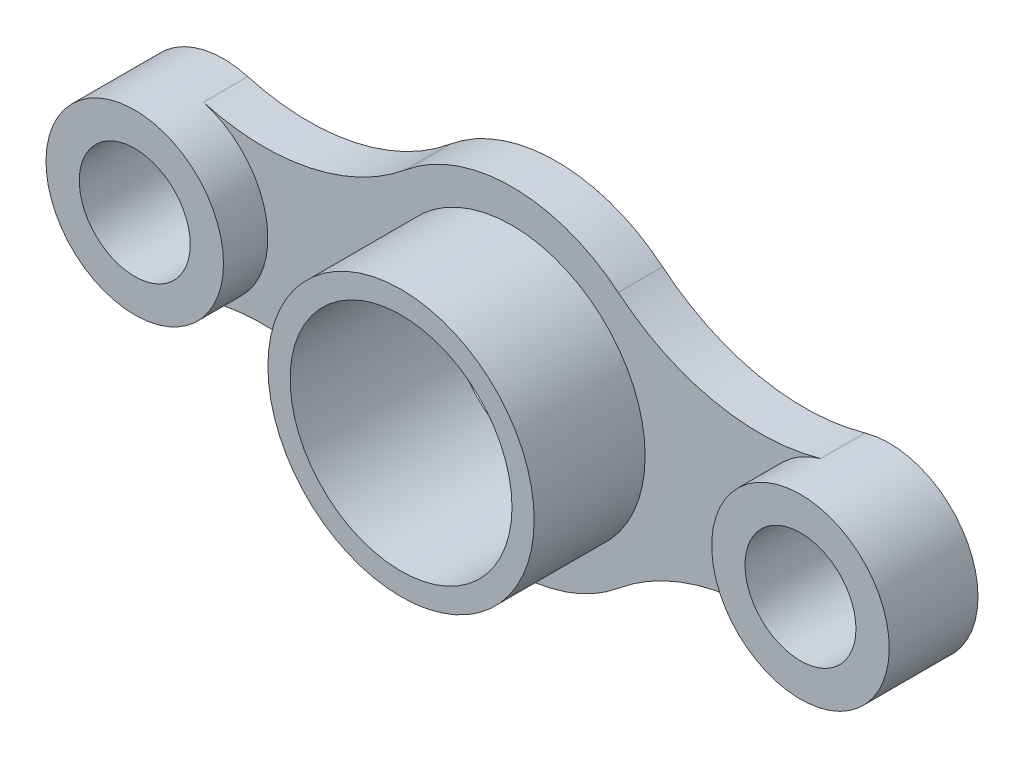
ISO-10303-21;
HEADER;
FILE_DESCRIPTION(('STEP AP214'),'2;1');
FILE_NAME('part.step','',(''),(''),'','','');
FILE_SCHEMA(('AUTOMOTIVE_DESIGN { 1 0 10303 214 1 1 1 1 }'));
ENDSEC;
DATA;
#1=APPLICATION_CONTEXT('core data for automotive mechanical design processes');
#2=APPLICATION_PROTOCOL_DEFINITION('international standard','automotive_design',2000,#1);
#3=PRODUCT_CONTEXT('',#1,'mechanical');
#4=PRODUCT('Part','Part','',(#3));
#5=PRODUCT_RELATED_PRODUCT_CATEGORY('part','',(#4));
#6=PRODUCT_DEFINITION_FORMATION('','',#4);
#7=PRODUCT_DEFINITION_CONTEXT('part definition',#1,'design');
#8=PRODUCT_DEFINITION('design','',#6,#7);
#9=PRODUCT_DEFINITION_SHAPE('','',#8);
#10=(LENGTH_UNIT() NAMED_UNIT(*) SI_UNIT(.MILLI.,.METRE.));
#11=(NAMED_UNIT(*) PLANE_ANGLE_UNIT() SI_UNIT($,.RADIAN.));
#12=(NAMED_UNIT(*) SI_UNIT($,.STERADIAN.) SOLID_ANGLE_UNIT());
#13=UNCERTAINTY_MEASURE_WITH_UNIT(LENGTH_MEASURE(1.E-05),#10,'distance_accuracy_value','');
#14=(GEOMETRIC_REPRESENTATION_CONTEXT(3) GLOBAL_UNCERTAINTY_ASSIGNED_CONTEXT((#13)) GLOBAL_UNIT_ASSIGNED_CONTEXT((#10,
#11,#12)) REPRESENTATION_CONTEXT('',''));
#15=CARTESIAN_POINT('',(0.,0.,0.));
#16=DIRECTION('',(0.,0.,1.));
#17=DIRECTION('',(1.,0.,0.));
#18=AXIS2_PLACEMENT_3D('',#15,#16,#17);
#19=CARTESIAN_POINT('',(-111.75,-134.673447642807,20.));
#20=DIRECTION('',(0.,0.,-1.));
#21=DIRECTION('',(-1.,0.,0.));
#22=AXIS2_PLACEMENT_3D('',#19,#20,#21);
#23=CYLINDRICAL_SURFACE('',#22,100.);
#24=CARTESIAN_POINT('',(-111.75,-134.673447642807,0.));
#25=DIRECTION('',(0.,0.,-1.));
#26=DIRECTION('',(-1.,0.,0.));
#27=AXIS2_PLACEMENT_3D('',#24,#25,#26);
#28=CIRCLE('',#27,100.);
#29=CARTESIAN_POINT('',(-139.071428571429,-38.478127897945,0.));
#30=VERTEX_POINT('',#29);
#31=CARTESIAN_POINT('',(-47.8928571428571,-57.7171918469175,0.));
#32=VERTEX_POINT('',#31);
#33=EDGE_CURVE('E139',#30,#32,#28,.T.);
#34=ORIENTED_EDGE('',*,*,#33,.T.);
#35=DIRECTION('',(0.,0.,-1.));
#36=VECTOR('',#35,1.);
#37=CARTESIAN_POINT('',(-47.8928571428571,-57.7171918469175,20.));
#38=LINE('',#37,#36);
#39=CARTESIAN_POINT('',(-47.8928571428571,-57.7171918469175,20.));
#40=VERTEX_POINT('',#39);
#41=EDGE_CURVE('E166',#40,#32,#38,.T.);
#42=ORIENTED_EDGE('',*,*,#41,.F.);
#43=CARTESIAN_POINT('',(-111.75,-134.673447642807,20.));
#44=DIRECTION('',(0.,0.,-1.));
#45=DIRECTION('',(-1.,0.,0.));
#46=AXIS2_PLACEMENT_3D('',#43,#44,#45);
#47=CIRCLE('',#46,100.);
#48=CARTESIAN_POINT('',(-139.071428571429,-38.478127897945,20.));
#49=VERTEX_POINT('',#48);
#50=EDGE_CURVE('E154',#49,#40,#47,.T.);
#51=ORIENTED_EDGE('',*,*,#50,.F.);
#52=DIRECTION('',(0.,0.,-1.));
#53=VECTOR('',#52,1.);
#54=CARTESIAN_POINT('',(-139.071428571429,-38.478127897945,20.));
#55=LINE('',#54,#53);
#56=EDGE_CURVE('E135',#49,#30,#55,.T.);
#57=ORIENTED_EDGE('',*,*,#56,.T.);
#58=EDGE_LOOP('',(#34,#42,#51,#57));
#59=FACE_BOUND('',#58,.T.);
#60=ADVANCED_FACE('F35',(#59),#23,.F.);
#61=CARTESIAN_POINT('',(0.,0.,20.));
#62=DIRECTION('',(0.,0.,-1.));
#63=DIRECTION('',(-1.,0.,0.));
#64=AXIS2_PLACEMENT_3D('',#61,#62,#63);
#65=CYLINDRICAL_SURFACE('',#64,75.);
#66=CARTESIAN_POINT('',(0.,0.,0.));
#67=DIRECTION('',(0.,0.,1.));
#68=DIRECTION('',(1.,0.,0.));
#69=AXIS2_PLACEMENT_3D('',#66,#67,#68);
#70=CIRCLE('',#69,75.);
#71=CARTESIAN_POINT('',(47.8928571428571,-57.7171918469175,0.));
#72=VERTEX_POINT('',#71);
#73=EDGE_CURVE('E142',#32,#72,#70,.T.);
#74=ORIENTED_EDGE('',*,*,#73,.T.);
#75=DIRECTION('',(0.,0.,-1.));
#76=VECTOR('',#75,1.);
#77=CARTESIAN_POINT('',(47.8928571428571,-57.7171918469175,20.));
#78=LINE('',#77,#76);
#79=CARTESIAN_POINT('',(47.8928571428571,-57.7171918469175,20.));
#80=VERTEX_POINT('',#79);
#81=EDGE_CURVE('E163',#80,#72,#78,.T.);
#82=ORIENTED_EDGE('',*,*,#81,.F.);
#83=CARTESIAN_POINT('',(0.,0.,20.));
#84=DIRECTION('',(0.,0.,1.));
#85=DIRECTION('',(1.,0.,0.));
#86=AXIS2_PLACEMENT_3D('',#83,#84,#85);
#87=CIRCLE('',#86,75.);
#88=EDGE_CURVE('E98',#40,#80,#87,.T.);
#89=ORIENTED_EDGE('',*,*,#88,.F.);
#90=ORIENTED_EDGE('',*,*,#41,.T.);
#91=EDGE_LOOP('',(#74,#82,#89,#90));
#92=FACE_BOUND('',#91,.T.);
#93=ADVANCED_FACE('F212',(#92),#65,.T.);
#94=CARTESIAN_POINT('',(111.75,-134.673447642807,20.));
#95=DIRECTION('',(0.,0.,-1.));
#96=DIRECTION('',(-1.,0.,0.));
#97=AXIS2_PLACEMENT_3D('',#94,#95,#96);
#98=CYLINDRICAL_SURFACE('',#97,100.);
#99=CARTESIAN_POINT('',(111.75,-134.673447642807,0.));
#100=DIRECTION('',(0.,0.,-1.));
#101=DIRECTION('',(1.,0.,0.));
#102=AXIS2_PLACEMENT_3D('',#99,#100,#101);
#103=CIRCLE('',#102,100.);
#104=CARTESIAN_POINT('',(139.071428571429,-38.478127897945,0.));
#105=VERTEX_POINT('',#104);
#106=EDGE_CURVE('E145',#72,#105,#103,.T.);
#107=ORIENTED_EDGE('',*,*,#106,.T.);
#108=DIRECTION('',(0.,0.,-1.));
#109=VECTOR('',#108,1.);
#110=CARTESIAN_POINT('',(139.071428571429,-38.478127897945,20.));
#111=LINE('',#110,#109);
#112=CARTESIAN_POINT('',(139.071428571429,-38.478127897945,20.));
#113=VERTEX_POINT('',#112);
#114=EDGE_CURVE('E160',#113,#105,#111,.T.);
#115=ORIENTED_EDGE('',*,*,#114,.F.);
#116=CARTESIAN_POINT('',(111.75,-134.673447642807,20.));
#117=DIRECTION('',(0.,0.,-1.));
#118=DIRECTION('',(1.,0.,0.));
#119=AXIS2_PLACEMENT_3D('',#116,#117,#118);
#120=CIRCLE('',#119,100.);
#121=EDGE_CURVE('E119',#80,#113,#120,.T.);
#122=ORIENTED_EDGE('',*,*,#121,.F.);
#123=ORIENTED_EDGE('',*,*,#81,.T.);
#124=EDGE_LOOP('',(#107,#115,#122,#123));
#125=FACE_BOUND('',#124,.T.);
#126=ADVANCED_FACE('F213',(#125),#98,.F.);
#127=CARTESIAN_POINT('',(150.,0.,20.));
#128=DIRECTION('',(0.,0.,-1.));
#129=DIRECTION('',(-1.,0.,0.));
#130=AXIS2_PLACEMENT_3D('',#127,#128,#129);
#131=CYLINDRICAL_SURFACE('',#130,40.);
#132=CARTESIAN_POINT('',(150.,0.,0.));
#133=DIRECTION('',(0.,0.,1.));
#134=DIRECTION('',(1.,0.,0.));
#135=AXIS2_PLACEMENT_3D('',#132,#133,#134);
#136=CIRCLE('',#135,40.);
#137=CARTESIAN_POINT('',(139.071428571429,38.478127897945,0.));
#138=VERTEX_POINT('',#137);
#139=EDGE_CURVE('E147',#105,#138,#136,.T.);
#140=ORIENTED_EDGE('',*,*,#139,.T.);
#141=DIRECTION('',(0.,0.,-1.));
#142=VECTOR('',#141,1.);
#143=CARTESIAN_POINT('',(139.071428571429,38.478127897945,20.));
#144=LINE('',#143,#142);
#145=CARTESIAN_POINT('',(139.071428571429,38.478127897945,20.));
#146=VERTEX_POINT('',#145);
#147=EDGE_CURVE('E128',#146,#138,#144,.T.);
#148=ORIENTED_EDGE('',*,*,#147,.F.);
#149=CARTESIAN_POINT('',(150.,0.,20.));
#150=DIRECTION('',(0.,0.,1.));
#151=DIRECTION('',(1.,0.,0.));
#152=AXIS2_PLACEMENT_3D('',#149,#150,#151);
#153=CIRCLE('',#152,40.);
#154=EDGE_CURVE('E115',#146,#113,#153,.T.);
#155=ORIENTED_EDGE('',*,*,#154,.T.);
#156=ORIENTED_EDGE('',*,*,#114,.T.);
#157=EDGE_LOOP('',(#140,#148,#155,#156));
#158=FACE_BOUND('',#157,.T.);
#159=CARTESIAN_POINT('',(150.,0.,40.));
#160=DIRECTION('',(0.,0.,1.));
#161=DIRECTION('',(1.,0.,0.));
#162=AXIS2_PLACEMENT_3D('',#159,#160,#161);
#163=CIRCLE('',#162,40.);
#164=CARTESIAN_POINT('',(190.,0.,40.));
#165=VERTEX_POINT('',#164);
#166=EDGE_CURVE('E186',#165,#165,#163,.T.);
#167=ORIENTED_EDGE('',*,*,#166,.F.);
#168=EDGE_LOOP('',(#167));
#169=FACE_BOUND('',#168,.T.);
#170=ADVANCED_FACE('F199',(#158,#169),#131,.T.);
#171=CARTESIAN_POINT('',(111.75,134.673447642807,20.));
#172=DIRECTION('',(0.,0.,-1.));
#173=DIRECTION('',(-1.,0.,0.));
#174=AXIS2_PLACEMENT_3D('',#171,#172,#173);
#175=CYLINDRICAL_SURFACE('',#174,100.);
#176=CARTESIAN_POINT('',(111.75,134.673447642807,0.));
#177=DIRECTION('',(0.,0.,-1.));
#178=DIRECTION('',(-1.,0.,0.));
#179=AXIS2_PLACEMENT_3D('',#176,#177,#178);
#180=CIRCLE('',#179,100.);
#181=CARTESIAN_POINT('',(47.8928571428571,57.7171918469175,0.));
#182=VERTEX_POINT('',#181);
#183=EDGE_CURVE('E125',#138,#182,#180,.T.);
#184=ORIENTED_EDGE('',*,*,#183,.T.);
#185=DIRECTION('',(0.,0.,-1.));
#186=VECTOR('',#185,1.);
#187=CARTESIAN_POINT('',(47.8928571428571,57.7171918469175,20.));
#188=LINE('',#187,#186);
#189=CARTESIAN_POINT('',(47.8928571428571,57.7171918469175,20.));
#190=VERTEX_POINT('',#189);
#191=EDGE_CURVE('E122',#190,#182,#188,.T.);
#192=ORIENTED_EDGE('',*,*,#191,.F.);
#193=CARTESIAN_POINT('',(111.75,134.673447642807,20.));
#194=DIRECTION('',(0.,0.,-1.));
#195=DIRECTION('',(-1.,0.,0.));
#196=AXIS2_PLACEMENT_3D('',#193,#194,#195);
#197=CIRCLE('',#196,100.);
#198=EDGE_CURVE('E107',#146,#190,#197,.T.);
#199=ORIENTED_EDGE('',*,*,#198,.F.);
#200=ORIENTED_EDGE('',*,*,#147,.T.);
#201=EDGE_LOOP('',(#184,#192,#199,#200));
#202=FACE_BOUND('',#201,.T.);
#203=ADVANCED_FACE('F123',(#202),#175,.F.);
#204=CARTESIAN_POINT('',(0.,0.,20.));
#205=DIRECTION('',(0.,0.,-1.));
#206=DIRECTION('',(-1.,0.,0.));
#207=AXIS2_PLACEMENT_3D('',#204,#205,#206);
#208=CYLINDRICAL_SURFACE('',#207,75.);
#209=CARTESIAN_POINT('',(0.,0.,0.));
#210=DIRECTION('',(0.,0.,1.));
#211=DIRECTION('',(1.,0.,0.));
#212=AXIS2_PLACEMENT_3D('',#209,#210,#211);
#213=CIRCLE('',#212,75.);
#214=CARTESIAN_POINT('',(-47.8928571428571,57.7171918469175,0.));
#215=VERTEX_POINT('',#214);
#216=EDGE_CURVE('E150',#182,#215,#213,.T.);
#217=ORIENTED_EDGE('',*,*,#216,.T.);
#218=DIRECTION('',(0.,0.,-1.));
#219=VECTOR('',#218,1.);
#220=CARTESIAN_POINT('',(-47.8928571428571,57.7171918469175,20.));
#221=LINE('',#220,#219);
#222=CARTESIAN_POINT('',(-47.8928571428571,57.7171918469175,20.));
#223=VERTEX_POINT('',#222);
#224=EDGE_CURVE('E129',#223,#215,#221,.T.);
#225=ORIENTED_EDGE('',*,*,#224,.F.);
#226=CARTESIAN_POINT('',(0.,0.,20.));
#227=DIRECTION('',(0.,0.,1.));
#228=DIRECTION('',(1.,0.,0.));
#229=AXIS2_PLACEMENT_3D('',#226,#227,#228);
#230=CIRCLE('',#229,75.);
#231=EDGE_CURVE('E111',#190,#223,#230,.T.);
#232=ORIENTED_EDGE('',*,*,#231,.F.);
#233=ORIENTED_EDGE('',*,*,#191,.T.);
#234=EDGE_LOOP('',(#217,#225,#232,#233));
#235=FACE_BOUND('',#234,.T.);
#236=ADVANCED_FACE('F131',(#235),#208,.T.);
#237=CARTESIAN_POINT('',(-111.75,134.673447642807,20.));
#238=DIRECTION('',(0.,0.,-1.));
#239=DIRECTION('',(-1.,0.,0.));
#240=AXIS2_PLACEMENT_3D('',#237,#238,#239);
#241=CYLINDRICAL_SURFACE('',#240,100.);
#242=CARTESIAN_POINT('',(-111.75,134.673447642807,0.));
#243=DIRECTION('',(0.,0.,-1.));
#244=DIRECTION('',(1.,0.,0.));
#245=AXIS2_PLACEMENT_3D('',#242,#243,#244);
#246=CIRCLE('',#245,100.);
#247=CARTESIAN_POINT('',(-139.071428571429,38.478127897945,0.));
#248=VERTEX_POINT('',#247);
#249=EDGE_CURVE('E83',#215,#248,#246,.T.);
#250=ORIENTED_EDGE('',*,*,#249,.T.);
#251=DIRECTION('',(0.,0.,-1.));
#252=VECTOR('',#251,1.);
#253=CARTESIAN_POINT('',(-139.071428571429,38.478127897945,20.));
#254=LINE('',#253,#252);
#255=CARTESIAN_POINT('',(-139.071428571429,38.478127897945,20.));
#256=VERTEX_POINT('',#255);
#257=EDGE_CURVE('E156',#256,#248,#254,.T.);
#258=ORIENTED_EDGE('',*,*,#257,.F.);
#259=CARTESIAN_POINT('',(-111.75,134.673447642807,20.));
#260=DIRECTION('',(0.,0.,-1.));
#261=DIRECTION('',(1.,0.,0.));
#262=AXIS2_PLACEMENT_3D('',#259,#260,#261);
#263=CIRCLE('',#262,100.);
#264=EDGE_CURVE('E133',#223,#256,#263,.T.);
#265=ORIENTED_EDGE('',*,*,#264,.F.);
#266=ORIENTED_EDGE('',*,*,#224,.T.);
#267=EDGE_LOOP('',(#250,#258,#265,#266));
#268=FACE_BOUND('',#267,.T.);
#269=ADVANCED_FACE('F206',(#268),#241,.F.);
#270=CARTESIAN_POINT('',(-150.,0.,20.));
#271=DIRECTION('',(0.,0.,-1.));
#272=DIRECTION('',(-1.,0.,0.));
#273=AXIS2_PLACEMENT_3D('',#270,#271,#272);
#274=CYLINDRICAL_SURFACE('',#273,40.);
#275=CARTESIAN_POINT('',(-150.,0.,0.));
#276=DIRECTION('',(0.,0.,1.));
#277=DIRECTION('',(1.,0.,0.));
#278=AXIS2_PLACEMENT_3D('',#275,#276,#277);
#279=CIRCLE('',#278,40.);
#280=EDGE_CURVE('E89',#248,#30,#279,.T.);
#281=ORIENTED_EDGE('',*,*,#280,.T.);
#282=ORIENTED_EDGE('',*,*,#56,.F.);
#283=CARTESIAN_POINT('',(-150.,0.,20.));
#284=DIRECTION('',(0.,0.,1.));
#285=DIRECTION('',(1.,0.,0.));
#286=AXIS2_PLACEMENT_3D('',#283,#284,#285);
#287=CIRCLE('',#286,40.);
#288=EDGE_CURVE('E44',#49,#256,#287,.T.);
#289=ORIENTED_EDGE('',*,*,#288,.T.);
#290=ORIENTED_EDGE('',*,*,#257,.T.);
#291=EDGE_LOOP('',(#281,#282,#289,#290));
#292=FACE_BOUND('',#291,.T.);
#293=CARTESIAN_POINT('',(-150.,0.,40.));
#294=DIRECTION('',(0.,0.,1.));
#295=DIRECTION('',(1.,0.,0.));
#296=AXIS2_PLACEMENT_3D('',#293,#294,#295);
#297=CIRCLE('',#296,40.);
#298=CARTESIAN_POINT('',(-110.,0.,40.));
#299=VERTEX_POINT('',#298);
#300=EDGE_CURVE('E143',#299,#299,#297,.T.);
#301=ORIENTED_EDGE('',*,*,#300,.F.);
#302=EDGE_LOOP('',(#301));
#303=FACE_BOUND('',#302,.T.);
#304=ADVANCED_FACE('F207',(#292,#303),#274,.T.);
#305=CARTESIAN_POINT('',(-55.875,-67.3367238214037,20.));
#306=DIRECTION('',(0.,0.,-1.));
#307=DIRECTION('',(-1.,0.,0.));
#308=AXIS2_PLACEMENT_3D('',#305,#306,#307);
#309=PLANE('',#308);
#310=CARTESIAN_POINT('',(0.,0.,20.));
#311=DIRECTION('',(0.,0.,-1.));
#312=DIRECTION('',(-1.,0.,0.));
#313=AXIS2_PLACEMENT_3D('',#310,#311,#312);
#314=CIRCLE('',#313,60.);
#315=CARTESIAN_POINT('',(-60.,0.,20.));
#316=VERTEX_POINT('',#315);
#317=EDGE_CURVE('E11',#316,#316,#314,.F.);
#318=ORIENTED_EDGE('',*,*,#317,.F.);
#319=EDGE_LOOP('',(#318));
#320=FACE_BOUND('',#319,.T.);
#321=ORIENTED_EDGE('',*,*,#154,.F.);
#322=ORIENTED_EDGE('',*,*,#198,.T.);
#323=ORIENTED_EDGE('',*,*,#231,.T.);
#324=ORIENTED_EDGE('',*,*,#264,.T.);
#325=ORIENTED_EDGE('',*,*,#288,.F.);
#326=ORIENTED_EDGE('',*,*,#50,.T.);
#327=ORIENTED_EDGE('',*,*,#88,.T.);
#328=ORIENTED_EDGE('',*,*,#121,.T.);
#329=EDGE_LOOP('',(#321,#322,#323,#324,#325,#326,#327,#328));
#330=FACE_BOUND('',#329,.T.);
#331=ADVANCED_FACE('F109',(#320,#330),#309,.F.);
#332=CARTESIAN_POINT('',(-55.875,-67.3367238214037,0.));
#333=DIRECTION('',(0.,0.,-1.));
#334=DIRECTION('',(-1.,0.,0.));
#335=AXIS2_PLACEMENT_3D('',#332,#333,#334);
#336=PLANE('',#335);
#337=CARTESIAN_POINT('',(150.,0.,0.));
#338=DIRECTION('',(0.,0.,1.));
#339=DIRECTION('',(1.,0.,0.));
#340=AXIS2_PLACEMENT_3D('',#337,#338,#339);
#341=CIRCLE('',#340,25.);
#342=CARTESIAN_POINT('',(175.,0.,0.));
#343=VERTEX_POINT('',#342);
#344=EDGE_CURVE('E372',#343,#343,#341,.T.);
#345=ORIENTED_EDGE('',*,*,#344,.T.);
#346=EDGE_LOOP('',(#345));
#347=FACE_BOUND('',#346,.T.);
#348=CARTESIAN_POINT('',(-150.,0.,0.));
#349=DIRECTION('',(0.,0.,1.));
#350=DIRECTION('',(1.,0.,0.));
#351=AXIS2_PLACEMENT_3D('',#348,#349,#350);
#352=CIRCLE('',#351,25.);
#353=CARTESIAN_POINT('',(-125.,0.,0.));
#354=VERTEX_POINT('',#353);
#355=EDGE_CURVE('E180',#354,#354,#352,.T.);
#356=ORIENTED_EDGE('',*,*,#355,.T.);
#357=EDGE_LOOP('',(#356));
#358=FACE_BOUND('',#357,.T.);
#359=CARTESIAN_POINT('',(0.,0.,0.));
#360=DIRECTION('',(0.,0.,1.));
#361=DIRECTION('',(1.,0.,0.));
#362=AXIS2_PLACEMENT_3D('',#359,#360,#361);
#363=CIRCLE('',#362,50.);
#364=CARTESIAN_POINT('',(50.,0.,0.));
#365=VERTEX_POINT('',#364);
#366=EDGE_CURVE('E169',#365,#365,#363,.T.);
#367=ORIENTED_EDGE('',*,*,#366,.T.);
#368=EDGE_LOOP('',(#367));
#369=FACE_BOUND('',#368,.T.);
#370=ORIENTED_EDGE('',*,*,#33,.F.);
#371=ORIENTED_EDGE('',*,*,#280,.F.);
#372=ORIENTED_EDGE('',*,*,#249,.F.);
#373=ORIENTED_EDGE('',*,*,#216,.F.);
#374=ORIENTED_EDGE('',*,*,#183,.F.);
#375=ORIENTED_EDGE('',*,*,#139,.F.);
#376=ORIENTED_EDGE('',*,*,#106,.F.);
#377=ORIENTED_EDGE('',*,*,#73,.F.);
#378=EDGE_LOOP('',(#370,#371,#372,#373,#374,#375,#376,#377));
#379=FACE_BOUND('',#378,.T.);
#380=ADVANCED_FACE('F204',(#347,#358,#369,#379),#336,.T.);
#381=CARTESIAN_POINT('',(-150.,0.,40.));
#382=DIRECTION('',(0.,0.,1.));
#383=DIRECTION('',(1.,0.,0.));
#384=AXIS2_PLACEMENT_3D('',#381,#382,#383);
#385=PLANE('',#384);
#386=CARTESIAN_POINT('',(-150.,0.,40.));
#387=DIRECTION('',(0.,0.,1.));
#388=DIRECTION('',(1.,0.,0.));
#389=AXIS2_PLACEMENT_3D('',#386,#387,#388);
#390=CIRCLE('',#389,25.);
#391=CARTESIAN_POINT('',(-125.,0.,40.));
#392=VERTEX_POINT('',#391);
#393=EDGE_CURVE('E38',#392,#392,#390,.T.);
#394=ORIENTED_EDGE('',*,*,#393,.F.);
#395=EDGE_LOOP('',(#394));
#396=FACE_BOUND('',#395,.T.);
#397=ORIENTED_EDGE('',*,*,#300,.T.);
#398=EDGE_LOOP('',(#397));
#399=FACE_BOUND('',#398,.T.);
#400=ADVANCED_FACE('F276',(#396,#399),#385,.T.);
#401=CARTESIAN_POINT('',(150.,0.,40.));
#402=DIRECTION('',(0.,0.,1.));
#403=DIRECTION('',(1.,0.,0.));
#404=AXIS2_PLACEMENT_3D('',#401,#402,#403);
#405=PLANE('',#404);
#406=CARTESIAN_POINT('',(150.,0.,40.));
#407=DIRECTION('',(0.,0.,1.));
#408=DIRECTION('',(1.,0.,0.));
#409=AXIS2_PLACEMENT_3D('',#406,#407,#408);
#410=CIRCLE('',#409,25.);
#411=CARTESIAN_POINT('',(175.,0.,40.));
#412=VERTEX_POINT('',#411);
#413=EDGE_CURVE('E167',#412,#412,#410,.T.);
#414=ORIENTED_EDGE('',*,*,#413,.F.);
#415=EDGE_LOOP('',(#414));
#416=FACE_BOUND('',#415,.T.);
#417=ORIENTED_EDGE('',*,*,#166,.T.);
#418=EDGE_LOOP('',(#417));
#419=FACE_BOUND('',#418,.T.);
#420=ADVANCED_FACE('F284',(#416,#419),#405,.T.);
#421=CARTESIAN_POINT('',(0.,0.,70.));
#422=DIRECTION('',(0.,0.,-1.));
#423=DIRECTION('',(-1.,0.,0.));
#424=AXIS2_PLACEMENT_3D('',#421,#422,#423);
#425=CYLINDRICAL_SURFACE('',#424,60.);
#426=CARTESIAN_POINT('',(0.,0.,70.));
#427=DIRECTION('',(0.,0.,1.));
#428=DIRECTION('',(1.,0.,0.));
#429=AXIS2_PLACEMENT_3D('',#426,#427,#428);
#430=CIRCLE('',#429,60.);
#431=CARTESIAN_POINT('',(60.,0.,70.));
#432=VERTEX_POINT('',#431);
#433=EDGE_CURVE('E173',#432,#432,#430,.T.);
#434=ORIENTED_EDGE('',*,*,#433,.F.);
#435=EDGE_LOOP('',(#434));
#436=FACE_BOUND('',#435,.T.);
#437=ORIENTED_EDGE('',*,*,#317,.T.);
#438=EDGE_LOOP('',(#437));
#439=FACE_BOUND('',#438,.T.);
#440=ADVANCED_FACE('F292',(#436,#439),#425,.T.);
#441=CARTESIAN_POINT('',(0.,0.,70.));
#442=DIRECTION('',(0.,0.,1.));
#443=DIRECTION('',(1.,0.,0.));
#444=AXIS2_PLACEMENT_3D('',#441,#442,#443);
#445=PLANE('',#444);
#446=CARTESIAN_POINT('',(0.,0.,70.));
#447=DIRECTION('',(0.,0.,1.));
#448=DIRECTION('',(1.,0.,0.));
#449=AXIS2_PLACEMENT_3D('',#446,#447,#448);
#450=CIRCLE('',#449,50.);
#451=CARTESIAN_POINT('',(50.,0.,70.));
#452=VERTEX_POINT('',#451);
#453=EDGE_CURVE('E175',#452,#452,#450,.T.);
#454=ORIENTED_EDGE('',*,*,#453,.F.);
#455=EDGE_LOOP('',(#454));
#456=FACE_BOUND('',#455,.T.);
#457=ORIENTED_EDGE('',*,*,#433,.T.);
#458=EDGE_LOOP('',(#457));
#459=FACE_BOUND('',#458,.T.);
#460=ADVANCED_FACE('F300',(#456,#459),#445,.T.);
#461=CARTESIAN_POINT('',(0.,0.,0.));
#462=DIRECTION('',(0.,0.,1.));
#463=DIRECTION('',(1.,0.,0.));
#464=AXIS2_PLACEMENT_3D('',#461,#462,#463);
#465=CYLINDRICAL_SURFACE('',#464,50.);
#466=ORIENTED_EDGE('',*,*,#366,.F.);
#467=EDGE_LOOP('',(#466));
#468=FACE_BOUND('',#467,.T.);
#469=ORIENTED_EDGE('',*,*,#453,.T.);
#470=EDGE_LOOP('',(#469));
#471=FACE_BOUND('',#470,.T.);
#472=ADVANCED_FACE('F307',(#468,#471),#465,.F.);
#473=CARTESIAN_POINT('',(150.,0.,0.));
#474=DIRECTION('',(0.,0.,1.));
#475=DIRECTION('',(1.,0.,0.));
#476=AXIS2_PLACEMENT_3D('',#473,#474,#475);
#477=CYLINDRICAL_SURFACE('',#476,25.);
#478=ORIENTED_EDGE('',*,*,#413,.T.);
#479=EDGE_LOOP('',(#478));
#480=FACE_BOUND('',#479,.T.);
#481=ORIENTED_EDGE('',*,*,#344,.F.);
#482=EDGE_LOOP('',(#481));
#483=FACE_BOUND('',#482,.T.);
#484=ADVANCED_FACE('F315',(#480,#483),#477,.F.);
#485=CARTESIAN_POINT('',(-150.,0.,0.));
#486=DIRECTION('',(0.,0.,1.));
#487=DIRECTION('',(1.,0.,0.));
#488=AXIS2_PLACEMENT_3D('',#485,#486,#487);
#489=CYLINDRICAL_SURFACE('',#488,25.);
#490=ORIENTED_EDGE('',*,*,#393,.T.);
#491=EDGE_LOOP('',(#490));
#492=FACE_BOUND('',#491,.T.);
#493=ORIENTED_EDGE('',*,*,#355,.F.);
#494=EDGE_LOOP('',(#493));
#495=FACE_BOUND('',#494,.T.);
#496=ADVANCED_FACE('F323',(#492,#495),#489,.F.);
#497=CLOSED_SHELL('',(#60,#93,#126,#170,#203,#236,#269,#304,#331,#380,#400,#420,#440,#460,#472,
#484,#496));
#498=MANIFOLD_SOLID_BREP('B2',#497);
#499=ADVANCED_BREP_SHAPE_REPRESENTATION('',(#18,#498),#14);
#500=SHAPE_DEFINITION_REPRESENTATION(#9,#499);
ENDSEC;
END-ISO-10303-21;
